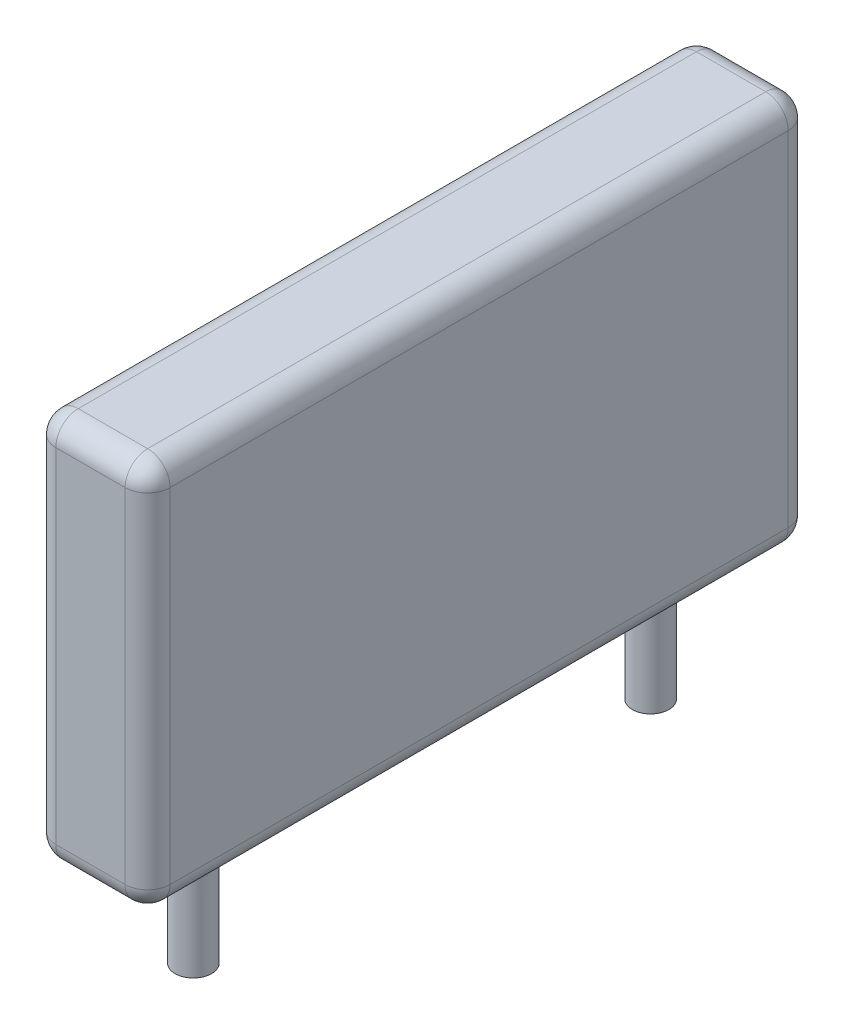
ISO-10303-21;
HEADER;
FILE_DESCRIPTION(('STEP AP214'),'2;1');
FILE_NAME('part.step','',(''),(''),'','','');
FILE_SCHEMA(('AUTOMOTIVE_DESIGN { 1 0 10303 214 1 1 1 1 }'));
ENDSEC;
DATA;
#1=APPLICATION_CONTEXT('core data for automotive mechanical design processes');
#2=APPLICATION_PROTOCOL_DEFINITION('international standard','automotive_design',2000,#1);
#3=PRODUCT_CONTEXT('',#1,'mechanical');
#4=PRODUCT('Part','Part','',(#3));
#5=PRODUCT_RELATED_PRODUCT_CATEGORY('part','',(#4));
#6=PRODUCT_DEFINITION_FORMATION('','',#4);
#7=PRODUCT_DEFINITION_CONTEXT('part definition',#1,'design');
#8=PRODUCT_DEFINITION('design','',#6,#7);
#9=PRODUCT_DEFINITION_SHAPE('','',#8);
#10=(LENGTH_UNIT() NAMED_UNIT(*) SI_UNIT(.MILLI.,.METRE.));
#11=(NAMED_UNIT(*) PLANE_ANGLE_UNIT() SI_UNIT($,.RADIAN.));
#12=(NAMED_UNIT(*) SI_UNIT($,.STERADIAN.) SOLID_ANGLE_UNIT());
#13=UNCERTAINTY_MEASURE_WITH_UNIT(LENGTH_MEASURE(1.E-05),#10,'distance_accuracy_value','');
#14=(GEOMETRIC_REPRESENTATION_CONTEXT(3) GLOBAL_UNCERTAINTY_ASSIGNED_CONTEXT((#13)) GLOBAL_UNIT_ASSIGNED_CONTEXT((#10,
#11,#12)) REPRESENTATION_CONTEXT('',''));
#15=CARTESIAN_POINT('',(0.,0.,0.));
#16=DIRECTION('',(0.,0.,1.));
#17=DIRECTION('',(1.,0.,0.));
#18=AXIS2_PLACEMENT_3D('',#15,#16,#17);
#19=CARTESIAN_POINT('',(1.27,-4.318,-7.36600000000001));
#20=DIRECTION('',(0.,0.,1.));
#21=DIRECTION('',(1.,0.,0.));
#22=AXIS2_PLACEMENT_3D('',#19,#20,#21);
#23=PLANE('',#22);
#24=DIRECTION('',(0.,1.,0.));
#25=VECTOR('',#24,1.);
#26=CARTESIAN_POINT('',(0.77,-4.318,-7.36600000000001));
#27=LINE('',#26,#25);
#28=CARTESIAN_POINT('',(0.77,3.818,-7.36600000000001));
#29=VERTEX_POINT('',#28);
#30=CARTESIAN_POINT('',(0.77,-3.818,-7.36600000000001));
#31=VERTEX_POINT('',#30);
#32=EDGE_CURVE('E162',#29,#31,#27,.F.);
#33=ORIENTED_EDGE('',*,*,#32,.T.);
#34=DIRECTION('',(-1.,0.,0.));
#35=VECTOR('',#34,1.);
#36=CARTESIAN_POINT('',(1.27,-3.818,-7.36600000000001));
#37=LINE('',#36,#35);
#38=CARTESIAN_POINT('',(-0.77,-3.818,-7.36600000000001));
#39=VERTEX_POINT('',#38);
#40=EDGE_CURVE('E166',#31,#39,#37,.T.);
#41=ORIENTED_EDGE('',*,*,#40,.T.);
#42=DIRECTION('',(0.,1.,0.));
#43=VECTOR('',#42,1.);
#44=CARTESIAN_POINT('',(-0.77,4.318,-7.36600000000001));
#45=LINE('',#44,#43);
#46=CARTESIAN_POINT('',(-0.77,3.818,-7.36600000000001));
#47=VERTEX_POINT('',#46);
#48=EDGE_CURVE('E136',#39,#47,#45,.T.);
#49=ORIENTED_EDGE('',*,*,#48,.T.);
#50=DIRECTION('',(-1.,0.,0.));
#51=VECTOR('',#50,1.);
#52=CARTESIAN_POINT('',(1.27,3.818,-7.36600000000001));
#53=LINE('',#52,#51);
#54=EDGE_CURVE('E156',#47,#29,#53,.F.);
#55=ORIENTED_EDGE('',*,*,#54,.T.);
#56=EDGE_LOOP('',(#33,#41,#49,#55));
#57=FACE_BOUND('',#56,.T.);
#58=ADVANCED_FACE('F38',(#57),#23,.F.);
#59=CARTESIAN_POINT('',(1.27,4.318,7.36599999999999));
#60=DIRECTION('',(0.,-1.,0.));
#61=DIRECTION('',(0.,0.,-1.));
#62=AXIS2_PLACEMENT_3D('',#59,#60,#61);
#63=PLANE('',#62);
#64=DIRECTION('',(0.,0.,1.));
#65=VECTOR('',#64,1.);
#66=CARTESIAN_POINT('',(0.77,4.318,7.36599999999999));
#67=LINE('',#66,#65);
#68=CARTESIAN_POINT('',(0.77,4.318,6.86599999999999));
#69=VERTEX_POINT('',#68);
#70=CARTESIAN_POINT('',(0.77,4.318,-6.86600000000001));
#71=VERTEX_POINT('',#70);
#72=EDGE_CURVE('E190',#69,#71,#67,.F.);
#73=ORIENTED_EDGE('',*,*,#72,.T.);
#74=DIRECTION('',(-1.,0.,0.));
#75=VECTOR('',#74,1.);
#76=CARTESIAN_POINT('',(1.27,4.318,-6.86600000000001));
#77=LINE('',#76,#75);
#78=CARTESIAN_POINT('',(-0.77,4.318,-6.86600000000001));
#79=VERTEX_POINT('',#78);
#80=EDGE_CURVE('E196',#71,#79,#77,.T.);
#81=ORIENTED_EDGE('',*,*,#80,.T.);
#82=DIRECTION('',(0.,0.,1.));
#83=VECTOR('',#82,1.);
#84=CARTESIAN_POINT('',(-0.77,4.318,7.36599999999999));
#85=LINE('',#84,#83);
#86=CARTESIAN_POINT('',(-0.77,4.318,6.86599999999999));
#87=VERTEX_POINT('',#86);
#88=EDGE_CURVE('E193',#79,#87,#85,.T.);
#89=ORIENTED_EDGE('',*,*,#88,.T.);
#90=DIRECTION('',(-1.,0.,0.));
#91=VECTOR('',#90,1.);
#92=CARTESIAN_POINT('',(1.27,4.318,6.86599999999999));
#93=LINE('',#92,#91);
#94=EDGE_CURVE('E187',#87,#69,#93,.F.);
#95=ORIENTED_EDGE('',*,*,#94,.T.);
#96=EDGE_LOOP('',(#73,#81,#89,#95));
#97=FACE_BOUND('',#96,.T.);
#98=ADVANCED_FACE('F345',(#97),#63,.F.);
#99=CARTESIAN_POINT('',(1.27,-4.318,7.36599999999999));
#100=DIRECTION('',(0.,0.,-1.));
#101=DIRECTION('',(-1.,0.,0.));
#102=AXIS2_PLACEMENT_3D('',#99,#100,#101);
#103=PLANE('',#102);
#104=DIRECTION('',(0.,-1.,0.));
#105=VECTOR('',#104,1.);
#106=CARTESIAN_POINT('',(-0.77,-4.318,7.36599999999999));
#107=LINE('',#106,#105);
#108=CARTESIAN_POINT('',(-0.77,3.818,7.36599999999999));
#109=VERTEX_POINT('',#108);
#110=CARTESIAN_POINT('',(-0.77,-3.818,7.36599999999999));
#111=VERTEX_POINT('',#110);
#112=EDGE_CURVE('E205',#109,#111,#107,.T.);
#113=ORIENTED_EDGE('',*,*,#112,.T.);
#114=DIRECTION('',(-1.,0.,0.));
#115=VECTOR('',#114,1.);
#116=CARTESIAN_POINT('',(1.27,-3.818,7.36599999999999));
#117=LINE('',#116,#115);
#118=CARTESIAN_POINT('',(0.77,-3.818,7.36599999999999));
#119=VERTEX_POINT('',#118);
#120=EDGE_CURVE('E209',#111,#119,#117,.F.);
#121=ORIENTED_EDGE('',*,*,#120,.T.);
#122=DIRECTION('',(0.,-1.,0.));
#123=VECTOR('',#122,1.);
#124=CARTESIAN_POINT('',(0.77,-4.318,7.36599999999999));
#125=LINE('',#124,#123);
#126=CARTESIAN_POINT('',(0.77,3.818,7.36599999999999));
#127=VERTEX_POINT('',#126);
#128=EDGE_CURVE('E202',#119,#127,#125,.F.);
#129=ORIENTED_EDGE('',*,*,#128,.T.);
#130=DIRECTION('',(-1.,0.,0.));
#131=VECTOR('',#130,1.);
#132=CARTESIAN_POINT('',(1.27,3.818,7.36599999999999));
#133=LINE('',#132,#131);
#134=EDGE_CURVE('E199',#127,#109,#133,.T.);
#135=ORIENTED_EDGE('',*,*,#134,.T.);
#136=EDGE_LOOP('',(#113,#121,#129,#135));
#137=FACE_BOUND('',#136,.T.);
#138=ADVANCED_FACE('F336',(#137),#103,.F.);
#139=CARTESIAN_POINT('',(1.27,-4.318,7.36599999999999));
#140=DIRECTION('',(0.,1.,0.));
#141=DIRECTION('',(0.,0.,1.));
#142=AXIS2_PLACEMENT_3D('',#139,#140,#141);
#143=PLANE('',#142);
#144=DIRECTION('',(0.,0.,-1.));
#145=VECTOR('',#144,1.);
#146=CARTESIAN_POINT('',(-0.77,-4.318,-7.36600000000001));
#147=LINE('',#146,#145);
#148=CARTESIAN_POINT('',(-0.77,-4.318,6.86599999999999));
#149=VERTEX_POINT('',#148);
#150=CARTESIAN_POINT('',(-0.77,-4.318,-6.86600000000001));
#151=VERTEX_POINT('',#150);
#152=EDGE_CURVE('E218',#149,#151,#147,.T.);
#153=ORIENTED_EDGE('',*,*,#152,.T.);
#154=DIRECTION('',(-1.,0.,0.));
#155=VECTOR('',#154,1.);
#156=CARTESIAN_POINT('',(1.27,-4.318,-6.86600000000001));
#157=LINE('',#156,#155);
#158=CARTESIAN_POINT('',(0.77,-4.318,-6.86600000000001));
#159=VERTEX_POINT('',#158);
#160=EDGE_CURVE('E222',#151,#159,#157,.F.);
#161=ORIENTED_EDGE('',*,*,#160,.T.);
#162=DIRECTION('',(0.,0.,-1.));
#163=VECTOR('',#162,1.);
#164=CARTESIAN_POINT('',(0.77,-4.318,7.36599999999999));
#165=LINE('',#164,#163);
#166=CARTESIAN_POINT('',(0.77,-4.318,6.86599999999999));
#167=VERTEX_POINT('',#166);
#168=EDGE_CURVE('E215',#159,#167,#165,.F.);
#169=ORIENTED_EDGE('',*,*,#168,.T.);
#170=DIRECTION('',(-1.,0.,0.));
#171=VECTOR('',#170,1.);
#172=CARTESIAN_POINT('',(1.27,-4.318,6.86599999999999));
#173=LINE('',#172,#171);
#174=EDGE_CURVE('E212',#167,#149,#173,.T.);
#175=ORIENTED_EDGE('',*,*,#174,.T.);
#176=EDGE_LOOP('',(#153,#161,#169,#175));
#177=FACE_BOUND('',#176,.T.);
#178=CARTESIAN_POINT('',(0.,-4.318,-5.08));
#179=DIRECTION('',(0.,1.,0.));
#180=DIRECTION('',(0.,0.,1.));
#181=AXIS2_PLACEMENT_3D('',#178,#179,#180);
#182=CIRCLE('',#181,0.4064);
#183=CARTESIAN_POINT('',(0.,-4.318,-4.6736));
#184=VERTEX_POINT('',#183);
#185=EDGE_CURVE('E308',#184,#184,#182,.T.);
#186=ORIENTED_EDGE('',*,*,#185,.T.);
#187=EDGE_LOOP('',(#186));
#188=FACE_BOUND('',#187,.T.);
#189=CARTESIAN_POINT('',(0.,-4.318,5.08));
#190=DIRECTION('',(0.,1.,0.));
#191=DIRECTION('',(0.,0.,1.));
#192=AXIS2_PLACEMENT_3D('',#189,#190,#191);
#193=CIRCLE('',#192,0.4064);
#194=CARTESIAN_POINT('',(0.,-4.318,5.4864));
#195=VERTEX_POINT('',#194);
#196=EDGE_CURVE('E163',#195,#195,#193,.F.);
#197=ORIENTED_EDGE('',*,*,#196,.F.);
#198=EDGE_LOOP('',(#197));
#199=FACE_BOUND('',#198,.T.);
#200=ADVANCED_FACE('F333',(#177,#188,#199),#143,.F.);
#201=CARTESIAN_POINT('',(1.27,0.,0.));
#202=DIRECTION('',(-1.,0.,0.));
#203=DIRECTION('',(0.,0.,1.));
#204=AXIS2_PLACEMENT_3D('',#201,#202,#203);
#205=PLANE('',#204);
#206=DIRECTION('',(0.,0.,-1.));
#207=VECTOR('',#206,1.);
#208=CARTESIAN_POINT('',(1.27,-3.818,0.));
#209=LINE('',#208,#207);
#210=CARTESIAN_POINT('',(1.27,-3.818,6.86599999999999));
#211=VERTEX_POINT('',#210);
#212=CARTESIAN_POINT('',(1.27,-3.818,-6.86600000000001));
#213=VERTEX_POINT('',#212);
#214=EDGE_CURVE('E225',#211,#213,#209,.T.);
#215=ORIENTED_EDGE('',*,*,#214,.T.);
#216=DIRECTION('',(0.,1.,0.));
#217=VECTOR('',#216,1.);
#218=CARTESIAN_POINT('',(1.27,0.,-6.86600000000001));
#219=LINE('',#218,#217);
#220=CARTESIAN_POINT('',(1.27,3.818,-6.86600000000001));
#221=VERTEX_POINT('',#220);
#222=EDGE_CURVE('E11',#213,#221,#219,.T.);
#223=ORIENTED_EDGE('',*,*,#222,.T.);
#224=DIRECTION('',(0.,0.,1.));
#225=VECTOR('',#224,1.);
#226=CARTESIAN_POINT('',(1.27,3.818,0.));
#227=LINE('',#226,#225);
#228=CARTESIAN_POINT('',(1.27,3.818,6.86599999999999));
#229=VERTEX_POINT('',#228);
#230=EDGE_CURVE('E48',#221,#229,#227,.T.);
#231=ORIENTED_EDGE('',*,*,#230,.T.);
#232=DIRECTION('',(0.,-1.,0.));
#233=VECTOR('',#232,1.);
#234=CARTESIAN_POINT('',(1.27,0.,6.86599999999999));
#235=LINE('',#234,#233);
#236=EDGE_CURVE('E228',#229,#211,#235,.T.);
#237=ORIENTED_EDGE('',*,*,#236,.T.);
#238=EDGE_LOOP('',(#215,#223,#231,#237));
#239=FACE_BOUND('',#238,.T.);
#240=ADVANCED_FACE('F335',(#239),#205,.F.);
#241=CARTESIAN_POINT('',(-1.27,0.,0.));
#242=DIRECTION('',(-1.,0.,0.));
#243=DIRECTION('',(0.,0.,1.));
#244=AXIS2_PLACEMENT_3D('',#241,#242,#243);
#245=PLANE('',#244);
#246=DIRECTION('',(0.,0.,1.));
#247=VECTOR('',#246,1.);
#248=CARTESIAN_POINT('',(-1.27,3.818,-7.36600000000001));
#249=LINE('',#248,#247);
#250=CARTESIAN_POINT('',(-1.27,3.818,6.86599999999999));
#251=VERTEX_POINT('',#250);
#252=CARTESIAN_POINT('',(-1.27,3.818,-6.86600000000001));
#253=VERTEX_POINT('',#252);
#254=EDGE_CURVE('E182',#251,#253,#249,.F.);
#255=ORIENTED_EDGE('',*,*,#254,.T.);
#256=DIRECTION('',(0.,1.,0.));
#257=VECTOR('',#256,1.);
#258=CARTESIAN_POINT('',(-1.27,-4.318,-6.86600000000001));
#259=LINE('',#258,#257);
#260=CARTESIAN_POINT('',(-1.27,-3.818,-6.86600000000001));
#261=VERTEX_POINT('',#260);
#262=EDGE_CURVE('E138',#253,#261,#259,.F.);
#263=ORIENTED_EDGE('',*,*,#262,.T.);
#264=DIRECTION('',(0.,0.,-1.));
#265=VECTOR('',#264,1.);
#266=CARTESIAN_POINT('',(-1.27,-3.818,7.36599999999999));
#267=LINE('',#266,#265);
#268=CARTESIAN_POINT('',(-1.27,-3.818,6.86599999999999));
#269=VERTEX_POINT('',#268);
#270=EDGE_CURVE('E172',#261,#269,#267,.F.);
#271=ORIENTED_EDGE('',*,*,#270,.T.);
#272=DIRECTION('',(0.,-1.,0.));
#273=VECTOR('',#272,1.);
#274=CARTESIAN_POINT('',(-1.27,4.318,6.86599999999999));
#275=LINE('',#274,#273);
#276=EDGE_CURVE('E179',#269,#251,#275,.F.);
#277=ORIENTED_EDGE('',*,*,#276,.T.);
#278=EDGE_LOOP('',(#255,#263,#271,#277));
#279=FACE_BOUND('',#278,.T.);
#280=ADVANCED_FACE('F343',(#279),#245,.T.);
#281=CARTESIAN_POINT('',(0.,-6.858,5.08));
#282=DIRECTION('',(0.,1.,0.));
#283=DIRECTION('',(0.,0.,1.));
#284=AXIS2_PLACEMENT_3D('',#281,#282,#283);
#285=CYLINDRICAL_SURFACE('',#284,0.4064);
#286=CARTESIAN_POINT('',(0.,-6.858,5.08));
#287=DIRECTION('',(0.,-1.,0.));
#288=DIRECTION('',(0.,0.,-1.));
#289=AXIS2_PLACEMENT_3D('',#286,#287,#288);
#290=CIRCLE('',#289,0.4064);
#291=CARTESIAN_POINT('',(0.,-6.858,4.6736));
#292=VERTEX_POINT('',#291);
#293=EDGE_CURVE('E321',#292,#292,#290,.T.);
#294=ORIENTED_EDGE('',*,*,#293,.F.);
#295=EDGE_LOOP('',(#294));
#296=FACE_BOUND('',#295,.T.);
#297=ORIENTED_EDGE('',*,*,#196,.T.);
#298=EDGE_LOOP('',(#297));
#299=FACE_BOUND('',#298,.T.);
#300=ADVANCED_FACE('F331',(#296,#299),#285,.T.);
#301=CARTESIAN_POINT('',(0.,-6.858,5.08));
#302=DIRECTION('',(0.,-1.,0.));
#303=DIRECTION('',(0.,0.,-1.));
#304=AXIS2_PLACEMENT_3D('',#301,#302,#303);
#305=PLANE('',#304);
#306=ORIENTED_EDGE('',*,*,#293,.T.);
#307=EDGE_LOOP('',(#306));
#308=FACE_BOUND('',#307,.T.);
#309=ADVANCED_FACE('F459',(#308),#305,.T.);
#310=CARTESIAN_POINT('',(0.,-6.858,-5.08));
#311=DIRECTION('',(0.,1.,0.));
#312=DIRECTION('',(0.,0.,1.));
#313=AXIS2_PLACEMENT_3D('',#310,#311,#312);
#314=CYLINDRICAL_SURFACE('',#313,0.4064);
#315=CARTESIAN_POINT('',(0.,-6.858,-5.08));
#316=DIRECTION('',(0.,1.,0.));
#317=DIRECTION('',(0.,0.,1.));
#318=AXIS2_PLACEMENT_3D('',#315,#316,#317);
#319=CIRCLE('',#318,0.4064);
#320=CARTESIAN_POINT('',(0.,-6.858,-4.6736));
#321=VERTEX_POINT('',#320);
#322=EDGE_CURVE('E315',#321,#321,#319,.T.);
#323=ORIENTED_EDGE('',*,*,#322,.T.);
#324=EDGE_LOOP('',(#323));
#325=FACE_BOUND('',#324,.T.);
#326=ORIENTED_EDGE('',*,*,#185,.F.);
#327=EDGE_LOOP('',(#326));
#328=FACE_BOUND('',#327,.T.);
#329=ADVANCED_FACE('F465',(#325,#328),#314,.T.);
#330=CARTESIAN_POINT('',(0.,-6.858,-5.08));
#331=DIRECTION('',(0.,-1.,0.));
#332=DIRECTION('',(0.,0.,1.));
#333=AXIS2_PLACEMENT_3D('',#330,#331,#332);
#334=PLANE('',#333);
#335=ORIENTED_EDGE('',*,*,#322,.F.);
#336=EDGE_LOOP('',(#335));
#337=FACE_BOUND('',#336,.T.);
#338=ADVANCED_FACE('F425',(#337),#334,.T.);
#339=CARTESIAN_POINT('',(0.77,0.,6.86599999999999));
#340=DIRECTION('',(0.,-1.,0.));
#341=DIRECTION('',(0.,0.,-1.));
#342=AXIS2_PLACEMENT_3D('',#339,#340,#341);
#343=CYLINDRICAL_SURFACE('',#342,0.5);
#344=CARTESIAN_POINT('',(0.77,-3.818,6.86599999999999));
#345=DIRECTION('',(0.,-1.,0.));
#346=DIRECTION('',(0.,0.,-1.));
#347=AXIS2_PLACEMENT_3D('',#344,#345,#346);
#348=CIRCLE('',#347,0.5);
#349=EDGE_CURVE('E42',#211,#119,#348,.T.);
#350=ORIENTED_EDGE('',*,*,#349,.F.);
#351=ORIENTED_EDGE('',*,*,#236,.F.);
#352=CARTESIAN_POINT('',(0.77,3.818,6.86599999999999));
#353=DIRECTION('',(0.,1.,0.));
#354=DIRECTION('',(-1.,0.,0.));
#355=AXIS2_PLACEMENT_3D('',#352,#353,#354);
#356=CIRCLE('',#355,0.5);
#357=EDGE_CURVE('E299',#127,#229,#356,.T.);
#358=ORIENTED_EDGE('',*,*,#357,.F.);
#359=ORIENTED_EDGE('',*,*,#128,.F.);
#360=EDGE_LOOP('',(#350,#351,#358,#359));
#361=FACE_BOUND('',#360,.T.);
#362=ADVANCED_FACE('F40',(#361),#343,.T.);
#363=CARTESIAN_POINT('',(0.77,-3.818,6.86599999999999));
#364=DIRECTION('',(0.,0.,1.));
#365=DIRECTION('',(1.,0.,0.));
#366=AXIS2_PLACEMENT_3D('',#363,#364,#365);
#367=SPHERICAL_SURFACE('',#366,0.5);
#368=CARTESIAN_POINT('',(0.77,-3.818,6.86599999999999));
#369=DIRECTION('',(0.,0.,1.));
#370=DIRECTION('',(1.,0.,0.));
#371=AXIS2_PLACEMENT_3D('',#368,#369,#370);
#372=CIRCLE('',#371,0.5);
#373=EDGE_CURVE('E292',#211,#167,#372,.F.);
#374=ORIENTED_EDGE('',*,*,#373,.F.);
#375=ORIENTED_EDGE('',*,*,#349,.T.);
#376=CARTESIAN_POINT('',(0.77,-3.818,6.86599999999999));
#377=DIRECTION('',(1.,0.,0.));
#378=DIRECTION('',(0.,0.,-1.));
#379=AXIS2_PLACEMENT_3D('',#376,#377,#378);
#380=CIRCLE('',#379,0.5);
#381=EDGE_CURVE('E296',#167,#119,#380,.F.);
#382=ORIENTED_EDGE('',*,*,#381,.F.);
#383=EDGE_LOOP('',(#374,#375,#382));
#384=FACE_BOUND('',#383,.T.);
#385=ADVANCED_FACE('F420',(#384),#367,.T.);
#386=CARTESIAN_POINT('',(0.77,3.818,6.86599999999999));
#387=DIRECTION('',(0.,0.,1.));
#388=DIRECTION('',(1.,0.,0.));
#389=AXIS2_PLACEMENT_3D('',#386,#387,#388);
#390=SPHERICAL_SURFACE('',#389,0.5);
#391=CARTESIAN_POINT('',(0.77,3.818,6.86599999999999));
#392=DIRECTION('',(1.,0.,0.));
#393=DIRECTION('',(0.,0.,-1.));
#394=AXIS2_PLACEMENT_3D('',#391,#392,#393);
#395=CIRCLE('',#394,0.5);
#396=EDGE_CURVE('E284',#127,#69,#395,.F.);
#397=ORIENTED_EDGE('',*,*,#396,.F.);
#398=ORIENTED_EDGE('',*,*,#357,.T.);
#399=CARTESIAN_POINT('',(0.77,3.818,6.86599999999999));
#400=DIRECTION('',(0.,0.,1.));
#401=DIRECTION('',(1.,0.,0.));
#402=AXIS2_PLACEMENT_3D('',#399,#400,#401);
#403=CIRCLE('',#402,0.5);
#404=EDGE_CURVE('E288',#69,#229,#403,.F.);
#405=ORIENTED_EDGE('',*,*,#404,.F.);
#406=EDGE_LOOP('',(#397,#398,#405));
#407=FACE_BOUND('',#406,.T.);
#408=ADVANCED_FACE('F417',(#407),#390,.T.);
#409=CARTESIAN_POINT('',(1.27,-3.818,6.86599999999999));
#410=DIRECTION('',(-1.,0.,0.));
#411=DIRECTION('',(0.,0.,1.));
#412=AXIS2_PLACEMENT_3D('',#409,#410,#411);
#413=CYLINDRICAL_SURFACE('',#412,0.5);
#414=ORIENTED_EDGE('',*,*,#381,.T.);
#415=ORIENTED_EDGE('',*,*,#120,.F.);
#416=CARTESIAN_POINT('',(-0.77,-3.818,6.86599999999999));
#417=DIRECTION('',(-1.,0.,0.));
#418=DIRECTION('',(0.,0.,1.));
#419=AXIS2_PLACEMENT_3D('',#416,#417,#418);
#420=CIRCLE('',#419,0.5);
#421=EDGE_CURVE('E277',#149,#111,#420,.T.);
#422=ORIENTED_EDGE('',*,*,#421,.F.);
#423=ORIENTED_EDGE('',*,*,#174,.F.);
#424=EDGE_LOOP('',(#414,#415,#422,#423));
#425=FACE_BOUND('',#424,.T.);
#426=ADVANCED_FACE('F413',(#425),#413,.T.);
#427=CARTESIAN_POINT('',(0.77,-3.818,0.));
#428=DIRECTION('',(0.,0.,-1.));
#429=DIRECTION('',(-1.,0.,0.));
#430=AXIS2_PLACEMENT_3D('',#427,#428,#429);
#431=CYLINDRICAL_SURFACE('',#430,0.5);
#432=ORIENTED_EDGE('',*,*,#373,.T.);
#433=ORIENTED_EDGE('',*,*,#168,.F.);
#434=CARTESIAN_POINT('',(0.77,-3.818,-6.86600000000001));
#435=DIRECTION('',(0.,0.,-1.));
#436=DIRECTION('',(-1.,0.,0.));
#437=AXIS2_PLACEMENT_3D('',#434,#435,#436);
#438=CIRCLE('',#437,0.5);
#439=EDGE_CURVE('E273',#213,#159,#438,.T.);
#440=ORIENTED_EDGE('',*,*,#439,.F.);
#441=ORIENTED_EDGE('',*,*,#214,.F.);
#442=EDGE_LOOP('',(#432,#433,#440,#441));
#443=FACE_BOUND('',#442,.T.);
#444=ADVANCED_FACE('F409',(#443),#431,.T.);
#445=CARTESIAN_POINT('',(0.77,0.,-6.86600000000001));
#446=DIRECTION('',(0.,1.,0.));
#447=DIRECTION('',(0.,0.,1.));
#448=AXIS2_PLACEMENT_3D('',#445,#446,#447);
#449=CYLINDRICAL_SURFACE('',#448,0.5);
#450=CARTESIAN_POINT('',(0.77,3.818,-6.86600000000001));
#451=DIRECTION('',(0.,1.,0.));
#452=DIRECTION('',(0.,0.,1.));
#453=AXIS2_PLACEMENT_3D('',#450,#451,#452);
#454=CIRCLE('',#453,0.5);
#455=EDGE_CURVE('E266',#221,#29,#454,.T.);
#456=ORIENTED_EDGE('',*,*,#455,.F.);
#457=ORIENTED_EDGE('',*,*,#222,.F.);
#458=CARTESIAN_POINT('',(0.77,-3.818,-6.86600000000001));
#459=DIRECTION('',(0.,-1.,0.));
#460=DIRECTION('',(0.,0.,-1.));
#461=AXIS2_PLACEMENT_3D('',#458,#459,#460);
#462=CIRCLE('',#461,0.5);
#463=EDGE_CURVE('E269',#31,#213,#462,.T.);
#464=ORIENTED_EDGE('',*,*,#463,.F.);
#465=ORIENTED_EDGE('',*,*,#32,.F.);
#466=EDGE_LOOP('',(#456,#457,#464,#465));
#467=FACE_BOUND('',#466,.T.);
#468=ADVANCED_FACE('F405',(#467),#449,.T.);
#469=CARTESIAN_POINT('',(0.77,3.818,0.));
#470=DIRECTION('',(0.,0.,1.));
#471=DIRECTION('',(1.,0.,0.));
#472=AXIS2_PLACEMENT_3D('',#469,#470,#471);
#473=CYLINDRICAL_SURFACE('',#472,0.5);
#474=ORIENTED_EDGE('',*,*,#404,.T.);
#475=ORIENTED_EDGE('',*,*,#230,.F.);
#476=CARTESIAN_POINT('',(0.77,3.818,-6.86600000000001));
#477=DIRECTION('',(0.,0.,-1.));
#478=DIRECTION('',(-1.,0.,0.));
#479=AXIS2_PLACEMENT_3D('',#476,#477,#478);
#480=CIRCLE('',#479,0.5);
#481=EDGE_CURVE('E56',#71,#221,#480,.T.);
#482=ORIENTED_EDGE('',*,*,#481,.F.);
#483=ORIENTED_EDGE('',*,*,#72,.F.);
#484=EDGE_LOOP('',(#474,#475,#482,#483));
#485=FACE_BOUND('',#484,.T.);
#486=ADVANCED_FACE('F401',(#485),#473,.T.);
#487=CARTESIAN_POINT('',(1.27,3.818,6.86599999999999));
#488=DIRECTION('',(-1.,0.,0.));
#489=DIRECTION('',(0.,0.,1.));
#490=AXIS2_PLACEMENT_3D('',#487,#488,#489);
#491=CYLINDRICAL_SURFACE('',#490,0.5);
#492=ORIENTED_EDGE('',*,*,#396,.T.);
#493=ORIENTED_EDGE('',*,*,#94,.F.);
#494=CARTESIAN_POINT('',(-0.77,3.818,6.86599999999999));
#495=DIRECTION('',(-1.,0.,0.));
#496=DIRECTION('',(0.,0.,1.));
#497=AXIS2_PLACEMENT_3D('',#494,#495,#496);
#498=CIRCLE('',#497,0.5);
#499=EDGE_CURVE('E260',#109,#87,#498,.T.);
#500=ORIENTED_EDGE('',*,*,#499,.F.);
#501=ORIENTED_EDGE('',*,*,#134,.F.);
#502=EDGE_LOOP('',(#492,#493,#500,#501));
#503=FACE_BOUND('',#502,.T.);
#504=ADVANCED_FACE('F397',(#503),#491,.T.);
#505=CARTESIAN_POINT('',(-0.77,-4.318,6.86599999999999));
#506=DIRECTION('',(0.,1.,0.));
#507=DIRECTION('',(0.,0.,1.));
#508=AXIS2_PLACEMENT_3D('',#505,#506,#507);
#509=CYLINDRICAL_SURFACE('',#508,0.5);
#510=CARTESIAN_POINT('',(-0.77,-3.818,6.86599999999999));
#511=DIRECTION('',(0.,-1.,0.));
#512=DIRECTION('',(0.,0.,-1.));
#513=AXIS2_PLACEMENT_3D('',#510,#511,#512);
#514=CIRCLE('',#513,0.5);
#515=EDGE_CURVE('E280',#111,#269,#514,.T.);
#516=ORIENTED_EDGE('',*,*,#515,.F.);
#517=ORIENTED_EDGE('',*,*,#112,.F.);
#518=CARTESIAN_POINT('',(-0.77,3.818,6.86599999999999));
#519=DIRECTION('',(0.,1.,0.));
#520=DIRECTION('',(0.,0.,1.));
#521=AXIS2_PLACEMENT_3D('',#518,#519,#520);
#522=CIRCLE('',#521,0.5);
#523=EDGE_CURVE('E256',#251,#109,#522,.T.);
#524=ORIENTED_EDGE('',*,*,#523,.F.);
#525=ORIENTED_EDGE('',*,*,#276,.F.);
#526=EDGE_LOOP('',(#516,#517,#524,#525));
#527=FACE_BOUND('',#526,.T.);
#528=ADVANCED_FACE('F393',(#527),#509,.T.);
#529=CARTESIAN_POINT('',(-0.77,-3.818,6.86599999999999));
#530=DIRECTION('',(0.,0.,1.));
#531=DIRECTION('',(1.,0.,0.));
#532=AXIS2_PLACEMENT_3D('',#529,#530,#531);
#533=SPHERICAL_SURFACE('',#532,0.5);
#534=ORIENTED_EDGE('',*,*,#421,.T.);
#535=ORIENTED_EDGE('',*,*,#515,.T.);
#536=CARTESIAN_POINT('',(-0.77,-3.818,6.86599999999999));
#537=DIRECTION('',(0.,0.,1.));
#538=DIRECTION('',(1.,0.,0.));
#539=AXIS2_PLACEMENT_3D('',#536,#537,#538);
#540=CIRCLE('',#539,0.5);
#541=EDGE_CURVE('E252',#149,#269,#540,.F.);
#542=ORIENTED_EDGE('',*,*,#541,.F.);
#543=EDGE_LOOP('',(#534,#535,#542));
#544=FACE_BOUND('',#543,.T.);
#545=ADVANCED_FACE('F389',(#544),#533,.T.);
#546=CARTESIAN_POINT('',(0.77,-3.818,-6.86600000000001));
#547=DIRECTION('',(0.,0.,1.));
#548=DIRECTION('',(1.,0.,0.));
#549=AXIS2_PLACEMENT_3D('',#546,#547,#548);
#550=SPHERICAL_SURFACE('',#549,0.5);
#551=ORIENTED_EDGE('',*,*,#463,.T.);
#552=ORIENTED_EDGE('',*,*,#439,.T.);
#553=CARTESIAN_POINT('',(0.77,-3.818,-6.86600000000001));
#554=DIRECTION('',(1.,0.,0.));
#555=DIRECTION('',(0.,0.,-1.));
#556=AXIS2_PLACEMENT_3D('',#553,#554,#555);
#557=CIRCLE('',#556,0.5);
#558=EDGE_CURVE('E248',#31,#159,#557,.F.);
#559=ORIENTED_EDGE('',*,*,#558,.F.);
#560=EDGE_LOOP('',(#551,#552,#559));
#561=FACE_BOUND('',#560,.T.);
#562=ADVANCED_FACE('F386',(#561),#550,.T.);
#563=CARTESIAN_POINT('',(0.77,3.818,-6.86600000000001));
#564=DIRECTION('',(0.,0.,1.));
#565=DIRECTION('',(1.,0.,0.));
#566=AXIS2_PLACEMENT_3D('',#563,#564,#565);
#567=SPHERICAL_SURFACE('',#566,0.5);
#568=ORIENTED_EDGE('',*,*,#481,.T.);
#569=ORIENTED_EDGE('',*,*,#455,.T.);
#570=CARTESIAN_POINT('',(0.77,3.818,-6.86600000000001));
#571=DIRECTION('',(1.,0.,0.));
#572=DIRECTION('',(0.,0.,-1.));
#573=AXIS2_PLACEMENT_3D('',#570,#571,#572);
#574=CIRCLE('',#573,0.5);
#575=EDGE_CURVE('E158',#71,#29,#574,.F.);
#576=ORIENTED_EDGE('',*,*,#575,.F.);
#577=EDGE_LOOP('',(#568,#569,#576));
#578=FACE_BOUND('',#577,.T.);
#579=ADVANCED_FACE('F382',(#578),#567,.T.);
#580=CARTESIAN_POINT('',(-0.77,3.818,6.86599999999999));
#581=DIRECTION('',(0.,0.,1.));
#582=DIRECTION('',(1.,0.,0.));
#583=AXIS2_PLACEMENT_3D('',#580,#581,#582);
#584=SPHERICAL_SURFACE('',#583,0.5);
#585=ORIENTED_EDGE('',*,*,#523,.T.);
#586=ORIENTED_EDGE('',*,*,#499,.T.);
#587=CARTESIAN_POINT('',(-0.77,3.818,6.86599999999999));
#588=DIRECTION('',(0.,0.,1.));
#589=DIRECTION('',(1.,0.,0.));
#590=AXIS2_PLACEMENT_3D('',#587,#588,#589);
#591=CIRCLE('',#590,0.5);
#592=EDGE_CURVE('E243',#251,#87,#591,.F.);
#593=ORIENTED_EDGE('',*,*,#592,.F.);
#594=EDGE_LOOP('',(#585,#586,#593));
#595=FACE_BOUND('',#594,.T.);
#596=ADVANCED_FACE('F378',(#595),#584,.T.);
#597=CARTESIAN_POINT('',(-0.77,-3.818,7.36599999999999));
#598=DIRECTION('',(0.,0.,1.));
#599=DIRECTION('',(1.,0.,0.));
#600=AXIS2_PLACEMENT_3D('',#597,#598,#599);
#601=CYLINDRICAL_SURFACE('',#600,0.5);
#602=ORIENTED_EDGE('',*,*,#541,.T.);
#603=ORIENTED_EDGE('',*,*,#270,.F.);
#604=CARTESIAN_POINT('',(-0.77,-3.818,-6.86600000000001));
#605=DIRECTION('',(0.,0.,-1.));
#606=DIRECTION('',(-1.,0.,0.));
#607=AXIS2_PLACEMENT_3D('',#604,#605,#606);
#608=CIRCLE('',#607,0.5);
#609=EDGE_CURVE('E239',#151,#261,#608,.T.);
#610=ORIENTED_EDGE('',*,*,#609,.F.);
#611=ORIENTED_EDGE('',*,*,#152,.F.);
#612=EDGE_LOOP('',(#602,#603,#610,#611));
#613=FACE_BOUND('',#612,.T.);
#614=ADVANCED_FACE('F374',(#613),#601,.T.);
#615=CARTESIAN_POINT('',(1.27,-3.818,-6.86600000000001));
#616=DIRECTION('',(-1.,0.,0.));
#617=DIRECTION('',(0.,0.,1.));
#618=AXIS2_PLACEMENT_3D('',#615,#616,#617);
#619=CYLINDRICAL_SURFACE('',#618,0.5);
#620=ORIENTED_EDGE('',*,*,#558,.T.);
#621=ORIENTED_EDGE('',*,*,#160,.F.);
#622=CARTESIAN_POINT('',(-0.77,-3.818,-6.86600000000001));
#623=DIRECTION('',(-1.,0.,0.));
#624=DIRECTION('',(0.,0.,1.));
#625=AXIS2_PLACEMENT_3D('',#622,#623,#624);
#626=CIRCLE('',#625,0.5);
#627=EDGE_CURVE('E153',#39,#151,#626,.T.);
#628=ORIENTED_EDGE('',*,*,#627,.F.);
#629=ORIENTED_EDGE('',*,*,#40,.F.);
#630=EDGE_LOOP('',(#620,#621,#628,#629));
#631=FACE_BOUND('',#630,.T.);
#632=ADVANCED_FACE('F371',(#631),#619,.T.);
#633=CARTESIAN_POINT('',(1.27,3.818,-6.86600000000001));
#634=DIRECTION('',(-1.,0.,0.));
#635=DIRECTION('',(0.,0.,1.));
#636=AXIS2_PLACEMENT_3D('',#633,#634,#635);
#637=CYLINDRICAL_SURFACE('',#636,0.5);
#638=ORIENTED_EDGE('',*,*,#575,.T.);
#639=ORIENTED_EDGE('',*,*,#54,.F.);
#640=CARTESIAN_POINT('',(-0.77,3.818,-6.86600000000001));
#641=DIRECTION('',(-1.,0.,0.));
#642=DIRECTION('',(0.,0.,1.));
#643=AXIS2_PLACEMENT_3D('',#640,#641,#642);
#644=CIRCLE('',#643,0.5);
#645=EDGE_CURVE('E145',#79,#47,#644,.T.);
#646=ORIENTED_EDGE('',*,*,#645,.F.);
#647=ORIENTED_EDGE('',*,*,#80,.F.);
#648=EDGE_LOOP('',(#638,#639,#646,#647));
#649=FACE_BOUND('',#648,.T.);
#650=ADVANCED_FACE('F157',(#649),#637,.T.);
#651=CARTESIAN_POINT('',(-0.77,3.818,7.36599999999999));
#652=DIRECTION('',(0.,0.,-1.));
#653=DIRECTION('',(-1.,0.,0.));
#654=AXIS2_PLACEMENT_3D('',#651,#652,#653);
#655=CYLINDRICAL_SURFACE('',#654,0.5);
#656=ORIENTED_EDGE('',*,*,#592,.T.);
#657=ORIENTED_EDGE('',*,*,#88,.F.);
#658=CARTESIAN_POINT('',(-0.77,3.818,-6.86600000000001));
#659=DIRECTION('',(0.,0.,-1.));
#660=DIRECTION('',(-1.,0.,0.));
#661=AXIS2_PLACEMENT_3D('',#658,#659,#660);
#662=CIRCLE('',#661,0.5);
#663=EDGE_CURVE('E149',#253,#79,#662,.T.);
#664=ORIENTED_EDGE('',*,*,#663,.F.);
#665=ORIENTED_EDGE('',*,*,#254,.F.);
#666=EDGE_LOOP('',(#656,#657,#664,#665));
#667=FACE_BOUND('',#666,.T.);
#668=ADVANCED_FACE('F364',(#667),#655,.T.);
#669=CARTESIAN_POINT('',(-0.77,-3.818,-6.86600000000001));
#670=DIRECTION('',(0.,0.,1.));
#671=DIRECTION('',(1.,0.,0.));
#672=AXIS2_PLACEMENT_3D('',#669,#670,#671);
#673=SPHERICAL_SURFACE('',#672,0.5);
#674=ORIENTED_EDGE('',*,*,#627,.T.);
#675=ORIENTED_EDGE('',*,*,#609,.T.);
#676=CARTESIAN_POINT('',(-0.77,-3.818,-6.86600000000001));
#677=DIRECTION('',(0.,-1.,0.));
#678=DIRECTION('',(0.,0.,-1.));
#679=AXIS2_PLACEMENT_3D('',#676,#677,#678);
#680=CIRCLE('',#679,0.5);
#681=EDGE_CURVE('E142',#39,#261,#680,.F.);
#682=ORIENTED_EDGE('',*,*,#681,.F.);
#683=EDGE_LOOP('',(#674,#675,#682));
#684=FACE_BOUND('',#683,.T.);
#685=ADVANCED_FACE('F361',(#684),#673,.T.);
#686=CARTESIAN_POINT('',(-0.77,3.818,-6.86600000000001));
#687=DIRECTION('',(0.,0.,1.));
#688=DIRECTION('',(1.,0.,0.));
#689=AXIS2_PLACEMENT_3D('',#686,#687,#688);
#690=SPHERICAL_SURFACE('',#689,0.5);
#691=ORIENTED_EDGE('',*,*,#663,.T.);
#692=ORIENTED_EDGE('',*,*,#645,.T.);
#693=CARTESIAN_POINT('',(-0.77,3.818,-6.86600000000001));
#694=DIRECTION('',(0.,1.,0.));
#695=DIRECTION('',(0.,0.,1.));
#696=AXIS2_PLACEMENT_3D('',#693,#694,#695);
#697=CIRCLE('',#696,0.5);
#698=EDGE_CURVE('E132',#253,#47,#697,.F.);
#699=ORIENTED_EDGE('',*,*,#698,.F.);
#700=EDGE_LOOP('',(#691,#692,#699));
#701=FACE_BOUND('',#700,.T.);
#702=ADVANCED_FACE('F147',(#701),#690,.T.);
#703=CARTESIAN_POINT('',(-0.77,-4.318,-6.86600000000001));
#704=DIRECTION('',(0.,-1.,0.));
#705=DIRECTION('',(0.,0.,-1.));
#706=AXIS2_PLACEMENT_3D('',#703,#704,#705);
#707=CYLINDRICAL_SURFACE('',#706,0.5);
#708=ORIENTED_EDGE('',*,*,#681,.T.);
#709=ORIENTED_EDGE('',*,*,#262,.F.);
#710=ORIENTED_EDGE('',*,*,#698,.T.);
#711=ORIENTED_EDGE('',*,*,#48,.F.);
#712=EDGE_LOOP('',(#708,#709,#710,#711));
#713=FACE_BOUND('',#712,.T.);
#714=ADVANCED_FACE('F134',(#713),#707,.T.);
#715=CLOSED_SHELL('',(#58,#98,#138,#200,#240,#280,#300,#309,#329,#338,#362,#385,#408,#426,#444,
#468,#486,#504,#528,#545,#562,#579,#596,#614,#632,#650,#668,#685,#702,#714));
#716=MANIFOLD_SOLID_BREP('B2',#715);
#717=ADVANCED_BREP_SHAPE_REPRESENTATION('',(#18,#716),#14);
#718=SHAPE_DEFINITION_REPRESENTATION(#9,#717);
ENDSEC;
END-ISO-10303-21;
